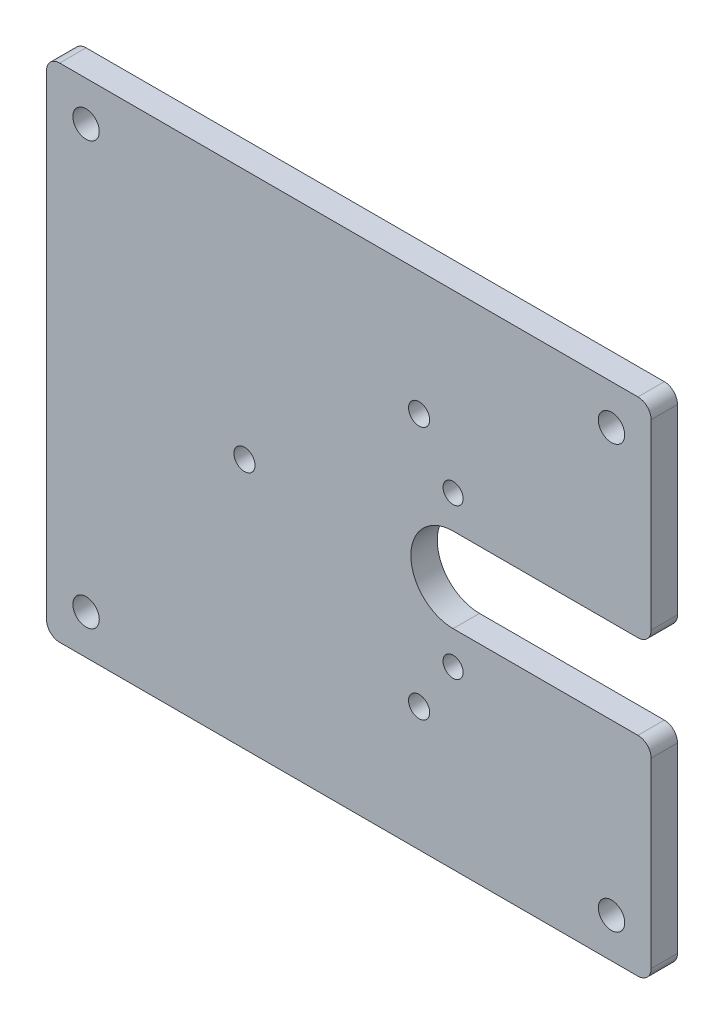
ISO-10303-21;
HEADER;
FILE_DESCRIPTION(('STEP AP214'),'2;1');
FILE_NAME('part.step','',(''),(''),'','','');
FILE_SCHEMA(('AUTOMOTIVE_DESIGN { 1 0 10303 214 1 1 1 1 }'));
ENDSEC;
DATA;
#1=APPLICATION_CONTEXT('core data for automotive mechanical design processes');
#2=APPLICATION_PROTOCOL_DEFINITION('international standard','automotive_design',2000,#1);
#3=PRODUCT_CONTEXT('',#1,'mechanical');
#4=PRODUCT('Part','Part','',(#3));
#5=PRODUCT_RELATED_PRODUCT_CATEGORY('part','',(#4));
#6=PRODUCT_DEFINITION_FORMATION('','',#4);
#7=PRODUCT_DEFINITION_CONTEXT('part definition',#1,'design');
#8=PRODUCT_DEFINITION('design','',#6,#7);
#9=PRODUCT_DEFINITION_SHAPE('','',#8);
#10=(LENGTH_UNIT() NAMED_UNIT(*) SI_UNIT(.MILLI.,.METRE.));
#11=(NAMED_UNIT(*) PLANE_ANGLE_UNIT() SI_UNIT($,.RADIAN.));
#12=(NAMED_UNIT(*) SI_UNIT($,.STERADIAN.) SOLID_ANGLE_UNIT());
#13=UNCERTAINTY_MEASURE_WITH_UNIT(LENGTH_MEASURE(1.E-05),#10,'distance_accuracy_value','');
#14=(GEOMETRIC_REPRESENTATION_CONTEXT(3) GLOBAL_UNCERTAINTY_ASSIGNED_CONTEXT((#13)) GLOBAL_UNIT_ASSIGNED_CONTEXT((#10,
#11,#12)) REPRESENTATION_CONTEXT('',''));
#15=CARTESIAN_POINT('',(0.,0.,0.));
#16=DIRECTION('',(0.,0.,1.));
#17=DIRECTION('',(1.,0.,0.));
#18=AXIS2_PLACEMENT_3D('',#15,#16,#17);
#19=CARTESIAN_POINT('',(57.,45.,5.));
#20=DIRECTION('',(0.,0.,-1.));
#21=DIRECTION('',(-1.,0.,0.));
#22=AXIS2_PLACEMENT_3D('',#19,#20,#21);
#23=PLANE('',#22);
#24=CARTESIAN_POINT('',(57.,45.,5.));
#25=DIRECTION('',(0.,0.,1.));
#26=DIRECTION('',(-1.,0.,0.));
#27=AXIS2_PLACEMENT_3D('',#24,#25,#26);
#28=CIRCLE('',#27,2.50000000000001);
#29=CARTESIAN_POINT('',(59.5,45.,5.));
#30=VERTEX_POINT('',#29);
#31=CARTESIAN_POINT('',(57.,47.5,5.));
#32=VERTEX_POINT('',#31);
#33=EDGE_CURVE('E196',#30,#32,#28,.T.);
#34=ORIENTED_EDGE('',*,*,#33,.T.);
#35=DIRECTION('',(-1.,0.,0.));
#36=VECTOR('',#35,1.);
#37=CARTESIAN_POINT('',(-52.5,47.5,5.));
#38=LINE('',#37,#36);
#39=CARTESIAN_POINT('',(-52.5,47.5,5.));
#40=VERTEX_POINT('',#39);
#41=EDGE_CURVE('E114',#32,#40,#38,.T.);
#42=ORIENTED_EDGE('',*,*,#41,.T.);
#43=CARTESIAN_POINT('',(-52.5,45.,5.));
#44=DIRECTION('',(0.,0.,1.));
#45=DIRECTION('',(1.,0.,0.));
#46=AXIS2_PLACEMENT_3D('',#43,#44,#45);
#47=CIRCLE('',#46,2.5);
#48=CARTESIAN_POINT('',(-55.,45.,5.));
#49=VERTEX_POINT('',#48);
#50=EDGE_CURVE('E229',#40,#49,#47,.T.);
#51=ORIENTED_EDGE('',*,*,#50,.T.);
#52=DIRECTION('',(0.,-1.,0.));
#53=VECTOR('',#52,1.);
#54=CARTESIAN_POINT('',(-55.,45.,5.));
#55=LINE('',#54,#53);
#56=CARTESIAN_POINT('',(-55.,-45.,5.));
#57=VERTEX_POINT('',#56);
#58=EDGE_CURVE('E248',#49,#57,#55,.T.);
#59=ORIENTED_EDGE('',*,*,#58,.T.);
#60=CARTESIAN_POINT('',(-52.5,-45.,5.));
#61=DIRECTION('',(0.,0.,1.));
#62=DIRECTION('',(-1.,0.,0.));
#63=AXIS2_PLACEMENT_3D('',#60,#61,#62);
#64=CIRCLE('',#63,2.5);
#65=CARTESIAN_POINT('',(-52.5,-47.5,5.));
#66=VERTEX_POINT('',#65);
#67=EDGE_CURVE('E245',#57,#66,#64,.T.);
#68=ORIENTED_EDGE('',*,*,#67,.T.);
#69=DIRECTION('',(1.,0.,0.));
#70=VECTOR('',#69,1.);
#71=CARTESIAN_POINT('',(-52.5,-47.5,5.));
#72=LINE('',#71,#70);
#73=CARTESIAN_POINT('',(57.,-47.5,5.));
#74=VERTEX_POINT('',#73);
#75=EDGE_CURVE('E247',#66,#74,#72,.T.);
#76=ORIENTED_EDGE('',*,*,#75,.T.);
#77=CARTESIAN_POINT('',(57.,-45.,5.));
#78=DIRECTION('',(0.,0.,1.));
#79=DIRECTION('',(1.,0.,0.));
#80=AXIS2_PLACEMENT_3D('',#77,#78,#79);
#81=CIRCLE('',#80,2.50000000000001);
#82=CARTESIAN_POINT('',(59.5,-45.,5.));
#83=VERTEX_POINT('',#82);
#84=EDGE_CURVE('E250',#74,#83,#81,.T.);
#85=ORIENTED_EDGE('',*,*,#84,.T.);
#86=DIRECTION('',(0.,1.,0.));
#87=VECTOR('',#86,1.);
#88=CARTESIAN_POINT('',(59.5,-45.,5.));
#89=LINE('',#88,#87);
#90=CARTESIAN_POINT('',(59.5,-10.5,5.));
#91=VERTEX_POINT('',#90);
#92=EDGE_CURVE('E256',#83,#91,#89,.T.);
#93=ORIENTED_EDGE('',*,*,#92,.T.);
#94=CARTESIAN_POINT('',(57.,-10.5,5.));
#95=DIRECTION('',(0.,0.,1.));
#96=DIRECTION('',(-1.,0.,0.));
#97=AXIS2_PLACEMENT_3D('',#94,#95,#96);
#98=CIRCLE('',#97,2.5);
#99=CARTESIAN_POINT('',(57.,-8.,5.));
#100=VERTEX_POINT('',#99);
#101=EDGE_CURVE('E258',#91,#100,#98,.T.);
#102=ORIENTED_EDGE('',*,*,#101,.T.);
#103=DIRECTION('',(-1.,0.,0.));
#104=VECTOR('',#103,1.);
#105=CARTESIAN_POINT('',(22.,-8.,5.));
#106=LINE('',#105,#104);
#107=CARTESIAN_POINT('',(22.,-8.,5.));
#108=VERTEX_POINT('',#107);
#109=EDGE_CURVE('E260',#100,#108,#106,.T.);
#110=ORIENTED_EDGE('',*,*,#109,.T.);
#111=CARTESIAN_POINT('',(22.,0.,5.));
#112=DIRECTION('',(0.,0.,-1.));
#113=DIRECTION('',(1.,0.,0.));
#114=AXIS2_PLACEMENT_3D('',#111,#112,#113);
#115=CIRCLE('',#114,8.);
#116=CARTESIAN_POINT('',(22.,8.,5.));
#117=VERTEX_POINT('',#116);
#118=EDGE_CURVE('E151',#108,#117,#115,.T.);
#119=ORIENTED_EDGE('',*,*,#118,.T.);
#120=DIRECTION('',(1.,0.,0.));
#121=VECTOR('',#120,1.);
#122=CARTESIAN_POINT('',(22.,8.,5.));
#123=LINE('',#122,#121);
#124=CARTESIAN_POINT('',(57.,8.,5.));
#125=VERTEX_POINT('',#124);
#126=EDGE_CURVE('E145',#117,#125,#123,.T.);
#127=ORIENTED_EDGE('',*,*,#126,.T.);
#128=CARTESIAN_POINT('',(57.,10.5,5.));
#129=DIRECTION('',(0.,0.,1.));
#130=DIRECTION('',(1.,0.,0.));
#131=AXIS2_PLACEMENT_3D('',#128,#129,#130);
#132=CIRCLE('',#131,2.5);
#133=CARTESIAN_POINT('',(59.5,10.5,5.));
#134=VERTEX_POINT('',#133);
#135=EDGE_CURVE('E149',#125,#134,#132,.T.);
#136=ORIENTED_EDGE('',*,*,#135,.T.);
#137=DIRECTION('',(0.,1.,0.));
#138=VECTOR('',#137,1.);
#139=CARTESIAN_POINT('',(59.5,45.,5.));
#140=LINE('',#139,#138);
#141=EDGE_CURVE('E53',#134,#30,#140,.T.);
#142=ORIENTED_EDGE('',*,*,#141,.T.);
#143=EDGE_LOOP('',(#34,#42,#51,#59,#68,#76,#85,#93,#102,#110,#119,#127,#136,#142));
#144=FACE_BOUND('',#143,.T.);
#145=CARTESIAN_POINT('',(22.,-14.25,5.));
#146=DIRECTION('',(0.,0.,1.));
#147=DIRECTION('',(1.,0.,0.));
#148=AXIS2_PLACEMENT_3D('',#145,#146,#147);
#149=CIRCLE('',#148,1.9);
#150=CARTESIAN_POINT('',(23.9,-14.25,5.));
#151=VERTEX_POINT('',#150);
#152=EDGE_CURVE('E173',#151,#151,#149,.T.);
#153=ORIENTED_EDGE('',*,*,#152,.F.);
#154=EDGE_LOOP('',(#153));
#155=FACE_BOUND('',#154,.T.);
#156=CARTESIAN_POINT('',(15.5628034052081,-24.,5.));
#157=DIRECTION('',(0.,0.,1.));
#158=DIRECTION('',(1.,0.,0.));
#159=AXIS2_PLACEMENT_3D('',#156,#157,#158);
#160=CIRCLE('',#159,2.);
#161=CARTESIAN_POINT('',(17.5628034052081,-24.,5.));
#162=VERTEX_POINT('',#161);
#163=EDGE_CURVE('E374',#162,#162,#160,.T.);
#164=ORIENTED_EDGE('',*,*,#163,.F.);
#165=EDGE_LOOP('',(#164));
#166=FACE_BOUND('',#165,.T.);
#167=CARTESIAN_POINT('',(15.5628034052081,24.,5.));
#168=DIRECTION('',(0.,0.,1.));
#169=DIRECTION('',(-1.,0.,0.));
#170=AXIS2_PLACEMENT_3D('',#167,#168,#169);
#171=CIRCLE('',#170,2.);
#172=CARTESIAN_POINT('',(13.5628034052081,24.,5.));
#173=VERTEX_POINT('',#172);
#174=EDGE_CURVE('E368',#173,#173,#171,.T.);
#175=ORIENTED_EDGE('',*,*,#174,.F.);
#176=EDGE_LOOP('',(#175));
#177=FACE_BOUND('',#176,.T.);
#178=CARTESIAN_POINT('',(22.,14.25,5.));
#179=DIRECTION('',(0.,0.,1.));
#180=DIRECTION('',(-1.,0.,0.));
#181=AXIS2_PLACEMENT_3D('',#178,#179,#180);
#182=CIRCLE('',#181,1.9);
#183=CARTESIAN_POINT('',(20.1,14.25,5.));
#184=VERTEX_POINT('',#183);
#185=EDGE_CURVE('E362',#184,#184,#182,.T.);
#186=ORIENTED_EDGE('',*,*,#185,.F.);
#187=EDGE_LOOP('',(#186));
#188=FACE_BOUND('',#187,.T.);
#189=CARTESIAN_POINT('',(-17.5,0.,5.));
#190=DIRECTION('',(0.,0.,1.));
#191=DIRECTION('',(1.,0.,0.));
#192=AXIS2_PLACEMENT_3D('',#189,#190,#191);
#193=CIRCLE('',#192,2.);
#194=CARTESIAN_POINT('',(-15.5,0.,5.));
#195=VERTEX_POINT('',#194);
#196=EDGE_CURVE('E356',#195,#195,#193,.T.);
#197=ORIENTED_EDGE('',*,*,#196,.F.);
#198=EDGE_LOOP('',(#197));
#199=FACE_BOUND('',#198,.T.);
#200=CARTESIAN_POINT('',(52.,-40.,5.));
#201=DIRECTION('',(0.,0.,1.));
#202=DIRECTION('',(1.,0.,0.));
#203=AXIS2_PLACEMENT_3D('',#200,#201,#202);
#204=CIRCLE('',#203,2.5);
#205=CARTESIAN_POINT('',(54.5,-40.,5.));
#206=VERTEX_POINT('',#205);
#207=EDGE_CURVE('E350',#206,#206,#204,.T.);
#208=ORIENTED_EDGE('',*,*,#207,.F.);
#209=EDGE_LOOP('',(#208));
#210=FACE_BOUND('',#209,.T.);
#211=CARTESIAN_POINT('',(-47.5,-40.,5.));
#212=DIRECTION('',(0.,0.,1.));
#213=DIRECTION('',(1.,0.,0.));
#214=AXIS2_PLACEMENT_3D('',#211,#212,#213);
#215=CIRCLE('',#214,2.5);
#216=CARTESIAN_POINT('',(-45.,-40.,5.));
#217=VERTEX_POINT('',#216);
#218=EDGE_CURVE('E344',#217,#217,#215,.T.);
#219=ORIENTED_EDGE('',*,*,#218,.F.);
#220=EDGE_LOOP('',(#219));
#221=FACE_BOUND('',#220,.T.);
#222=CARTESIAN_POINT('',(-47.5,40.,5.));
#223=DIRECTION('',(0.,0.,1.));
#224=DIRECTION('',(-1.,0.,0.));
#225=AXIS2_PLACEMENT_3D('',#222,#223,#224);
#226=CIRCLE('',#225,2.5);
#227=CARTESIAN_POINT('',(-50.,40.,5.));
#228=VERTEX_POINT('',#227);
#229=EDGE_CURVE('E338',#228,#228,#226,.T.);
#230=ORIENTED_EDGE('',*,*,#229,.F.);
#231=EDGE_LOOP('',(#230));
#232=FACE_BOUND('',#231,.T.);
#233=CARTESIAN_POINT('',(52.,40.,5.));
#234=DIRECTION('',(0.,0.,1.));
#235=DIRECTION('',(-1.,0.,0.));
#236=AXIS2_PLACEMENT_3D('',#233,#234,#235);
#237=CIRCLE('',#236,2.5);
#238=CARTESIAN_POINT('',(49.5,40.,5.));
#239=VERTEX_POINT('',#238);
#240=EDGE_CURVE('E329',#239,#239,#237,.T.);
#241=ORIENTED_EDGE('',*,*,#240,.F.);
#242=EDGE_LOOP('',(#241));
#243=FACE_BOUND('',#242,.T.);
#244=ADVANCED_FACE('F36',(#144,#155,#166,#177,#188,#199,#210,#221,#232,#243),#23,.F.);
#245=CARTESIAN_POINT('',(57.,45.,0.));
#246=DIRECTION('',(0.,0.,-1.));
#247=DIRECTION('',(-1.,0.,0.));
#248=AXIS2_PLACEMENT_3D('',#245,#246,#247);
#249=PLANE('',#248);
#250=CARTESIAN_POINT('',(-47.5,40.,0.));
#251=DIRECTION('',(0.,0.,1.));
#252=DIRECTION('',(-1.,0.,0.));
#253=AXIS2_PLACEMENT_3D('',#250,#251,#252);
#254=CIRCLE('',#253,2.5);
#255=CARTESIAN_POINT('',(-50.,40.,0.));
#256=VERTEX_POINT('',#255);
#257=EDGE_CURVE('E335',#256,#256,#254,.T.);
#258=ORIENTED_EDGE('',*,*,#257,.T.);
#259=EDGE_LOOP('',(#258));
#260=FACE_BOUND('',#259,.T.);
#261=CARTESIAN_POINT('',(52.,-40.,0.));
#262=DIRECTION('',(0.,0.,1.));
#263=DIRECTION('',(1.,0.,0.));
#264=AXIS2_PLACEMENT_3D('',#261,#262,#263);
#265=CIRCLE('',#264,2.5);
#266=CARTESIAN_POINT('',(54.5,-40.,0.));
#267=VERTEX_POINT('',#266);
#268=EDGE_CURVE('E347',#267,#267,#265,.T.);
#269=ORIENTED_EDGE('',*,*,#268,.T.);
#270=EDGE_LOOP('',(#269));
#271=FACE_BOUND('',#270,.T.);
#272=CARTESIAN_POINT('',(22.,14.25,0.));
#273=DIRECTION('',(0.,0.,1.));
#274=DIRECTION('',(-1.,0.,0.));
#275=AXIS2_PLACEMENT_3D('',#272,#273,#274);
#276=CIRCLE('',#275,1.9);
#277=CARTESIAN_POINT('',(20.1,14.25,0.));
#278=VERTEX_POINT('',#277);
#279=EDGE_CURVE('E359',#278,#278,#276,.T.);
#280=ORIENTED_EDGE('',*,*,#279,.T.);
#281=EDGE_LOOP('',(#280));
#282=FACE_BOUND('',#281,.T.);
#283=CARTESIAN_POINT('',(15.5628034052081,-24.,0.));
#284=DIRECTION('',(0.,0.,1.));
#285=DIRECTION('',(1.,0.,0.));
#286=AXIS2_PLACEMENT_3D('',#283,#284,#285);
#287=CIRCLE('',#286,2.);
#288=CARTESIAN_POINT('',(17.5628034052081,-24.,0.));
#289=VERTEX_POINT('',#288);
#290=EDGE_CURVE('E371',#289,#289,#287,.T.);
#291=ORIENTED_EDGE('',*,*,#290,.T.);
#292=EDGE_LOOP('',(#291));
#293=FACE_BOUND('',#292,.T.);
#294=CARTESIAN_POINT('',(57.,45.,0.));
#295=DIRECTION('',(0.,0.,1.));
#296=DIRECTION('',(-1.,0.,0.));
#297=AXIS2_PLACEMENT_3D('',#294,#295,#296);
#298=CIRCLE('',#297,2.50000000000001);
#299=CARTESIAN_POINT('',(59.5,45.,0.));
#300=VERTEX_POINT('',#299);
#301=CARTESIAN_POINT('',(57.,47.5,0.));
#302=VERTEX_POINT('',#301);
#303=EDGE_CURVE('E169',#300,#302,#298,.T.);
#304=ORIENTED_EDGE('',*,*,#303,.F.);
#305=DIRECTION('',(0.,1.,0.));
#306=VECTOR('',#305,1.);
#307=CARTESIAN_POINT('',(59.5,45.,0.));
#308=LINE('',#307,#306);
#309=CARTESIAN_POINT('',(59.5,10.5,0.));
#310=VERTEX_POINT('',#309);
#311=EDGE_CURVE('E106',#310,#300,#308,.T.);
#312=ORIENTED_EDGE('',*,*,#311,.F.);
#313=CARTESIAN_POINT('',(57.,10.5,0.));
#314=DIRECTION('',(0.,0.,1.));
#315=DIRECTION('',(1.,0.,0.));
#316=AXIS2_PLACEMENT_3D('',#313,#314,#315);
#317=CIRCLE('',#316,2.5);
#318=CARTESIAN_POINT('',(57.,8.,0.));
#319=VERTEX_POINT('',#318);
#320=EDGE_CURVE('E100',#319,#310,#317,.T.);
#321=ORIENTED_EDGE('',*,*,#320,.F.);
#322=DIRECTION('',(1.,0.,0.));
#323=VECTOR('',#322,1.);
#324=CARTESIAN_POINT('',(22.,8.,0.));
#325=LINE('',#324,#323);
#326=CARTESIAN_POINT('',(22.,8.,0.));
#327=VERTEX_POINT('',#326);
#328=EDGE_CURVE('E159',#327,#319,#325,.T.);
#329=ORIENTED_EDGE('',*,*,#328,.F.);
#330=CARTESIAN_POINT('',(22.,0.,0.));
#331=DIRECTION('',(0.,0.,-1.));
#332=DIRECTION('',(1.,0.,0.));
#333=AXIS2_PLACEMENT_3D('',#330,#331,#332);
#334=CIRCLE('',#333,8.);
#335=CARTESIAN_POINT('',(22.,-8.,0.));
#336=VERTEX_POINT('',#335);
#337=EDGE_CURVE('E191',#336,#327,#334,.T.);
#338=ORIENTED_EDGE('',*,*,#337,.F.);
#339=DIRECTION('',(-1.,0.,0.));
#340=VECTOR('',#339,1.);
#341=CARTESIAN_POINT('',(22.,-8.,0.));
#342=LINE('',#341,#340);
#343=CARTESIAN_POINT('',(57.,-8.,0.));
#344=VERTEX_POINT('',#343);
#345=EDGE_CURVE('E189',#344,#336,#342,.T.);
#346=ORIENTED_EDGE('',*,*,#345,.F.);
#347=CARTESIAN_POINT('',(57.,-10.5,0.));
#348=DIRECTION('',(0.,0.,1.));
#349=DIRECTION('',(-1.,0.,0.));
#350=AXIS2_PLACEMENT_3D('',#347,#348,#349);
#351=CIRCLE('',#350,2.5);
#352=CARTESIAN_POINT('',(59.5,-10.5,0.));
#353=VERTEX_POINT('',#352);
#354=EDGE_CURVE('E187',#353,#344,#351,.T.);
#355=ORIENTED_EDGE('',*,*,#354,.F.);
#356=DIRECTION('',(0.,1.,0.));
#357=VECTOR('',#356,1.);
#358=CARTESIAN_POINT('',(59.5,-45.,0.));
#359=LINE('',#358,#357);
#360=CARTESIAN_POINT('',(59.5,-45.,0.));
#361=VERTEX_POINT('',#360);
#362=EDGE_CURVE('E185',#361,#353,#359,.T.);
#363=ORIENTED_EDGE('',*,*,#362,.F.);
#364=CARTESIAN_POINT('',(57.,-45.,0.));
#365=DIRECTION('',(0.,0.,1.));
#366=DIRECTION('',(1.,0.,0.));
#367=AXIS2_PLACEMENT_3D('',#364,#365,#366);
#368=CIRCLE('',#367,2.50000000000001);
#369=CARTESIAN_POINT('',(57.,-47.5,0.));
#370=VERTEX_POINT('',#369);
#371=EDGE_CURVE('E183',#370,#361,#368,.T.);
#372=ORIENTED_EDGE('',*,*,#371,.F.);
#373=DIRECTION('',(1.,0.,0.));
#374=VECTOR('',#373,1.);
#375=CARTESIAN_POINT('',(-52.5,-47.5,0.));
#376=LINE('',#375,#374);
#377=CARTESIAN_POINT('',(-52.5,-47.5,0.));
#378=VERTEX_POINT('',#377);
#379=EDGE_CURVE('E181',#378,#370,#376,.T.);
#380=ORIENTED_EDGE('',*,*,#379,.F.);
#381=CARTESIAN_POINT('',(-52.5,-45.,0.));
#382=DIRECTION('',(0.,0.,1.));
#383=DIRECTION('',(-1.,0.,0.));
#384=AXIS2_PLACEMENT_3D('',#381,#382,#383);
#385=CIRCLE('',#384,2.5);
#386=CARTESIAN_POINT('',(-55.,-45.,0.));
#387=VERTEX_POINT('',#386);
#388=EDGE_CURVE('E179',#387,#378,#385,.T.);
#389=ORIENTED_EDGE('',*,*,#388,.F.);
#390=DIRECTION('',(0.,-1.,0.));
#391=VECTOR('',#390,1.);
#392=CARTESIAN_POINT('',(-55.,45.,0.));
#393=LINE('',#392,#391);
#394=CARTESIAN_POINT('',(-55.,45.,0.));
#395=VERTEX_POINT('',#394);
#396=EDGE_CURVE('E177',#395,#387,#393,.T.);
#397=ORIENTED_EDGE('',*,*,#396,.F.);
#398=CARTESIAN_POINT('',(-52.5,45.,0.));
#399=DIRECTION('',(0.,0.,1.));
#400=DIRECTION('',(1.,0.,0.));
#401=AXIS2_PLACEMENT_3D('',#398,#399,#400);
#402=CIRCLE('',#401,2.5);
#403=CARTESIAN_POINT('',(-52.5,47.5,0.));
#404=VERTEX_POINT('',#403);
#405=EDGE_CURVE('E175',#404,#395,#402,.T.);
#406=ORIENTED_EDGE('',*,*,#405,.F.);
#407=DIRECTION('',(-1.,0.,0.));
#408=VECTOR('',#407,1.);
#409=CARTESIAN_POINT('',(-52.5,47.5,0.));
#410=LINE('',#409,#408);
#411=EDGE_CURVE('E172',#302,#404,#410,.T.);
#412=ORIENTED_EDGE('',*,*,#411,.F.);
#413=EDGE_LOOP('',(#304,#312,#321,#329,#338,#346,#355,#363,#372,#380,#389,#397,#406,#412));
#414=FACE_BOUND('',#413,.T.);
#415=CARTESIAN_POINT('',(22.,-14.25,0.));
#416=DIRECTION('',(0.,0.,1.));
#417=DIRECTION('',(1.,0.,0.));
#418=AXIS2_PLACEMENT_3D('',#415,#416,#417);
#419=CIRCLE('',#418,1.9);
#420=CARTESIAN_POINT('',(23.9,-14.25,0.));
#421=VERTEX_POINT('',#420);
#422=EDGE_CURVE('E377',#421,#421,#419,.T.);
#423=ORIENTED_EDGE('',*,*,#422,.T.);
#424=EDGE_LOOP('',(#423));
#425=FACE_BOUND('',#424,.T.);
#426=CARTESIAN_POINT('',(15.5628034052081,24.,0.));
#427=DIRECTION('',(0.,0.,1.));
#428=DIRECTION('',(-1.,0.,0.));
#429=AXIS2_PLACEMENT_3D('',#426,#427,#428);
#430=CIRCLE('',#429,2.);
#431=CARTESIAN_POINT('',(13.5628034052081,24.,0.));
#432=VERTEX_POINT('',#431);
#433=EDGE_CURVE('E365',#432,#432,#430,.T.);
#434=ORIENTED_EDGE('',*,*,#433,.T.);
#435=EDGE_LOOP('',(#434));
#436=FACE_BOUND('',#435,.T.);
#437=CARTESIAN_POINT('',(-17.5,0.,0.));
#438=DIRECTION('',(0.,0.,1.));
#439=DIRECTION('',(1.,0.,0.));
#440=AXIS2_PLACEMENT_3D('',#437,#438,#439);
#441=CIRCLE('',#440,2.);
#442=CARTESIAN_POINT('',(-15.5,0.,0.));
#443=VERTEX_POINT('',#442);
#444=EDGE_CURVE('E353',#443,#443,#441,.T.);
#445=ORIENTED_EDGE('',*,*,#444,.T.);
#446=EDGE_LOOP('',(#445));
#447=FACE_BOUND('',#446,.T.);
#448=CARTESIAN_POINT('',(-47.5,-40.,0.));
#449=DIRECTION('',(0.,0.,1.));
#450=DIRECTION('',(1.,0.,0.));
#451=AXIS2_PLACEMENT_3D('',#448,#449,#450);
#452=CIRCLE('',#451,2.5);
#453=CARTESIAN_POINT('',(-45.,-40.,0.));
#454=VERTEX_POINT('',#453);
#455=EDGE_CURVE('E341',#454,#454,#452,.T.);
#456=ORIENTED_EDGE('',*,*,#455,.T.);
#457=EDGE_LOOP('',(#456));
#458=FACE_BOUND('',#457,.T.);
#459=CARTESIAN_POINT('',(52.,40.,0.));
#460=DIRECTION('',(0.,0.,1.));
#461=DIRECTION('',(-1.,0.,0.));
#462=AXIS2_PLACEMENT_3D('',#459,#460,#461);
#463=CIRCLE('',#462,2.5);
#464=CARTESIAN_POINT('',(49.5,40.,0.));
#465=VERTEX_POINT('',#464);
#466=EDGE_CURVE('E332',#465,#465,#463,.T.);
#467=ORIENTED_EDGE('',*,*,#466,.T.);
#468=EDGE_LOOP('',(#467));
#469=FACE_BOUND('',#468,.T.);
#470=ADVANCED_FACE('F233',(#260,#271,#282,#293,#414,#425,#436,#447,#458,#469),#249,.T.);
#471=CARTESIAN_POINT('',(57.,45.,5.));
#472=DIRECTION('',(0.,0.,-1.));
#473=DIRECTION('',(-1.,0.,0.));
#474=AXIS2_PLACEMENT_3D('',#471,#472,#473);
#475=CYLINDRICAL_SURFACE('',#474,2.50000000000001);
#476=ORIENTED_EDGE('',*,*,#303,.T.);
#477=DIRECTION('',(0.,0.,-1.));
#478=VECTOR('',#477,1.);
#479=CARTESIAN_POINT('',(57.,47.5,5.));
#480=LINE('',#479,#478);
#481=EDGE_CURVE('E11',#32,#302,#480,.T.);
#482=ORIENTED_EDGE('',*,*,#481,.F.);
#483=ORIENTED_EDGE('',*,*,#33,.F.);
#484=DIRECTION('',(0.,0.,-1.));
#485=VECTOR('',#484,1.);
#486=CARTESIAN_POINT('',(59.5,45.,5.));
#487=LINE('',#486,#485);
#488=EDGE_CURVE('E165',#30,#300,#487,.T.);
#489=ORIENTED_EDGE('',*,*,#488,.T.);
#490=EDGE_LOOP('',(#476,#482,#483,#489));
#491=FACE_BOUND('',#490,.T.);
#492=ADVANCED_FACE('F38',(#491),#475,.T.);
#493=CARTESIAN_POINT('',(-52.5,47.5,5.));
#494=DIRECTION('',(0.,-1.,0.));
#495=DIRECTION('',(0.,0.,-1.));
#496=AXIS2_PLACEMENT_3D('',#493,#494,#495);
#497=PLANE('',#496);
#498=ORIENTED_EDGE('',*,*,#411,.T.);
#499=DIRECTION('',(0.,0.,-1.));
#500=VECTOR('',#499,1.);
#501=CARTESIAN_POINT('',(-52.5,47.5,5.));
#502=LINE('',#501,#500);
#503=EDGE_CURVE('E45',#40,#404,#502,.T.);
#504=ORIENTED_EDGE('',*,*,#503,.F.);
#505=ORIENTED_EDGE('',*,*,#41,.F.);
#506=ORIENTED_EDGE('',*,*,#481,.T.);
#507=EDGE_LOOP('',(#498,#504,#505,#506));
#508=FACE_BOUND('',#507,.T.);
#509=ADVANCED_FACE('F554',(#508),#497,.F.);
#510=CARTESIAN_POINT('',(-52.5,45.,5.));
#511=DIRECTION('',(0.,0.,-1.));
#512=DIRECTION('',(-1.,0.,0.));
#513=AXIS2_PLACEMENT_3D('',#510,#511,#512);
#514=CYLINDRICAL_SURFACE('',#513,2.5);
#515=ORIENTED_EDGE('',*,*,#405,.T.);
#516=DIRECTION('',(0.,0.,-1.));
#517=VECTOR('',#516,1.);
#518=CARTESIAN_POINT('',(-55.,45.,5.));
#519=LINE('',#518,#517);
#520=EDGE_CURVE('E221',#49,#395,#519,.T.);
#521=ORIENTED_EDGE('',*,*,#520,.F.);
#522=ORIENTED_EDGE('',*,*,#50,.F.);
#523=ORIENTED_EDGE('',*,*,#503,.T.);
#524=EDGE_LOOP('',(#515,#521,#522,#523));
#525=FACE_BOUND('',#524,.T.);
#526=ADVANCED_FACE('F227',(#525),#514,.T.);
#527=CARTESIAN_POINT('',(-55.,45.,5.));
#528=DIRECTION('',(1.,0.,0.));
#529=DIRECTION('',(0.,0.,-1.));
#530=AXIS2_PLACEMENT_3D('',#527,#528,#529);
#531=PLANE('',#530);
#532=ORIENTED_EDGE('',*,*,#396,.T.);
#533=DIRECTION('',(0.,0.,-1.));
#534=VECTOR('',#533,1.);
#535=CARTESIAN_POINT('',(-55.,-45.,5.));
#536=LINE('',#535,#534);
#537=EDGE_CURVE('E218',#57,#387,#536,.T.);
#538=ORIENTED_EDGE('',*,*,#537,.F.);
#539=ORIENTED_EDGE('',*,*,#58,.F.);
#540=ORIENTED_EDGE('',*,*,#520,.T.);
#541=EDGE_LOOP('',(#532,#538,#539,#540));
#542=FACE_BOUND('',#541,.T.);
#543=ADVANCED_FACE('F239',(#542),#531,.F.);
#544=CARTESIAN_POINT('',(-52.5,-45.,5.));
#545=DIRECTION('',(0.,0.,-1.));
#546=DIRECTION('',(-1.,0.,0.));
#547=AXIS2_PLACEMENT_3D('',#544,#545,#546);
#548=CYLINDRICAL_SURFACE('',#547,2.5);
#549=ORIENTED_EDGE('',*,*,#388,.T.);
#550=DIRECTION('',(0.,0.,-1.));
#551=VECTOR('',#550,1.);
#552=CARTESIAN_POINT('',(-52.5,-47.5,5.));
#553=LINE('',#552,#551);
#554=EDGE_CURVE('E215',#66,#378,#553,.T.);
#555=ORIENTED_EDGE('',*,*,#554,.F.);
#556=ORIENTED_EDGE('',*,*,#67,.F.);
#557=ORIENTED_EDGE('',*,*,#537,.T.);
#558=EDGE_LOOP('',(#549,#555,#556,#557));
#559=FACE_BOUND('',#558,.T.);
#560=ADVANCED_FACE('F243',(#559),#548,.T.);
#561=CARTESIAN_POINT('',(-52.5,-47.5,5.));
#562=DIRECTION('',(0.,1.,0.));
#563=DIRECTION('',(0.,0.,1.));
#564=AXIS2_PLACEMENT_3D('',#561,#562,#563);
#565=PLANE('',#564);
#566=ORIENTED_EDGE('',*,*,#379,.T.);
#567=DIRECTION('',(0.,0.,-1.));
#568=VECTOR('',#567,1.);
#569=CARTESIAN_POINT('',(57.,-47.5,5.));
#570=LINE('',#569,#568);
#571=EDGE_CURVE('E212',#74,#370,#570,.T.);
#572=ORIENTED_EDGE('',*,*,#571,.F.);
#573=ORIENTED_EDGE('',*,*,#75,.F.);
#574=ORIENTED_EDGE('',*,*,#554,.T.);
#575=EDGE_LOOP('',(#566,#572,#573,#574));
#576=FACE_BOUND('',#575,.T.);
#577=ADVANCED_FACE('F519',(#576),#565,.F.);
#578=CARTESIAN_POINT('',(57.,-45.,5.));
#579=DIRECTION('',(0.,0.,-1.));
#580=DIRECTION('',(-1.,0.,0.));
#581=AXIS2_PLACEMENT_3D('',#578,#579,#580);
#582=CYLINDRICAL_SURFACE('',#581,2.50000000000001);
#583=ORIENTED_EDGE('',*,*,#371,.T.);
#584=DIRECTION('',(0.,0.,-1.));
#585=VECTOR('',#584,1.);
#586=CARTESIAN_POINT('',(59.5,-45.,5.));
#587=LINE('',#586,#585);
#588=EDGE_CURVE('E209',#83,#361,#587,.T.);
#589=ORIENTED_EDGE('',*,*,#588,.F.);
#590=ORIENTED_EDGE('',*,*,#84,.F.);
#591=ORIENTED_EDGE('',*,*,#571,.T.);
#592=EDGE_LOOP('',(#583,#589,#590,#591));
#593=FACE_BOUND('',#592,.T.);
#594=ADVANCED_FACE('F509',(#593),#582,.T.);
#595=CARTESIAN_POINT('',(59.5,-45.,5.));
#596=DIRECTION('',(-1.,0.,0.));
#597=DIRECTION('',(0.,0.,1.));
#598=AXIS2_PLACEMENT_3D('',#595,#596,#597);
#599=PLANE('',#598);
#600=ORIENTED_EDGE('',*,*,#362,.T.);
#601=DIRECTION('',(0.,0.,-1.));
#602=VECTOR('',#601,1.);
#603=CARTESIAN_POINT('',(59.5,-10.5,5.));
#604=LINE('',#603,#602);
#605=EDGE_CURVE('E206',#91,#353,#604,.T.);
#606=ORIENTED_EDGE('',*,*,#605,.F.);
#607=ORIENTED_EDGE('',*,*,#92,.F.);
#608=ORIENTED_EDGE('',*,*,#588,.T.);
#609=EDGE_LOOP('',(#600,#606,#607,#608));
#610=FACE_BOUND('',#609,.T.);
#611=ADVANCED_FACE('F499',(#610),#599,.F.);
#612=CARTESIAN_POINT('',(57.,-10.5,5.));
#613=DIRECTION('',(0.,0.,-1.));
#614=DIRECTION('',(-1.,0.,0.));
#615=AXIS2_PLACEMENT_3D('',#612,#613,#614);
#616=CYLINDRICAL_SURFACE('',#615,2.5);
#617=ORIENTED_EDGE('',*,*,#354,.T.);
#618=DIRECTION('',(0.,0.,-1.));
#619=VECTOR('',#618,1.);
#620=CARTESIAN_POINT('',(57.,-8.,5.));
#621=LINE('',#620,#619);
#622=EDGE_CURVE('E203',#100,#344,#621,.T.);
#623=ORIENTED_EDGE('',*,*,#622,.F.);
#624=ORIENTED_EDGE('',*,*,#101,.F.);
#625=ORIENTED_EDGE('',*,*,#605,.T.);
#626=EDGE_LOOP('',(#617,#623,#624,#625));
#627=FACE_BOUND('',#626,.T.);
#628=ADVANCED_FACE('F490',(#627),#616,.T.);
#629=CARTESIAN_POINT('',(22.,-8.,5.));
#630=DIRECTION('',(0.,-1.,0.));
#631=DIRECTION('',(0.,0.,-1.));
#632=AXIS2_PLACEMENT_3D('',#629,#630,#631);
#633=PLANE('',#632);
#634=ORIENTED_EDGE('',*,*,#345,.T.);
#635=DIRECTION('',(0.,0.,-1.));
#636=VECTOR('',#635,1.);
#637=CARTESIAN_POINT('',(22.,-8.,5.));
#638=LINE('',#637,#636);
#639=EDGE_CURVE('E200',#108,#336,#638,.T.);
#640=ORIENTED_EDGE('',*,*,#639,.F.);
#641=ORIENTED_EDGE('',*,*,#109,.F.);
#642=ORIENTED_EDGE('',*,*,#622,.T.);
#643=EDGE_LOOP('',(#634,#640,#641,#642));
#644=FACE_BOUND('',#643,.T.);
#645=ADVANCED_FACE('F266',(#644),#633,.F.);
#646=CARTESIAN_POINT('',(22.,0.,5.));
#647=DIRECTION('',(0.,0.,-1.));
#648=DIRECTION('',(-1.,0.,0.));
#649=AXIS2_PLACEMENT_3D('',#646,#647,#648);
#650=CYLINDRICAL_SURFACE('',#649,8.);
#651=ORIENTED_EDGE('',*,*,#337,.T.);
#652=DIRECTION('',(0.,0.,-1.));
#653=VECTOR('',#652,1.);
#654=CARTESIAN_POINT('',(22.,8.,5.));
#655=LINE('',#654,#653);
#656=EDGE_CURVE('E160',#117,#327,#655,.T.);
#657=ORIENTED_EDGE('',*,*,#656,.F.);
#658=ORIENTED_EDGE('',*,*,#118,.F.);
#659=ORIENTED_EDGE('',*,*,#639,.T.);
#660=EDGE_LOOP('',(#651,#657,#658,#659));
#661=FACE_BOUND('',#660,.T.);
#662=ADVANCED_FACE('F270',(#661),#650,.F.);
#663=CARTESIAN_POINT('',(22.,8.,5.));
#664=DIRECTION('',(0.,1.,0.));
#665=DIRECTION('',(0.,0.,1.));
#666=AXIS2_PLACEMENT_3D('',#663,#664,#665);
#667=PLANE('',#666);
#668=ORIENTED_EDGE('',*,*,#328,.T.);
#669=DIRECTION('',(0.,0.,-1.));
#670=VECTOR('',#669,1.);
#671=CARTESIAN_POINT('',(57.,8.,5.));
#672=LINE('',#671,#670);
#673=EDGE_CURVE('E156',#125,#319,#672,.T.);
#674=ORIENTED_EDGE('',*,*,#673,.F.);
#675=ORIENTED_EDGE('',*,*,#126,.F.);
#676=ORIENTED_EDGE('',*,*,#656,.T.);
#677=EDGE_LOOP('',(#668,#674,#675,#676));
#678=FACE_BOUND('',#677,.T.);
#679=ADVANCED_FACE('F157',(#678),#667,.F.);
#680=CARTESIAN_POINT('',(57.,10.5,5.));
#681=DIRECTION('',(0.,0.,-1.));
#682=DIRECTION('',(-1.,0.,0.));
#683=AXIS2_PLACEMENT_3D('',#680,#681,#682);
#684=CYLINDRICAL_SURFACE('',#683,2.5);
#685=ORIENTED_EDGE('',*,*,#320,.T.);
#686=DIRECTION('',(0.,0.,-1.));
#687=VECTOR('',#686,1.);
#688=CARTESIAN_POINT('',(59.5,10.5,5.));
#689=LINE('',#688,#687);
#690=EDGE_CURVE('E161',#134,#310,#689,.T.);
#691=ORIENTED_EDGE('',*,*,#690,.F.);
#692=ORIENTED_EDGE('',*,*,#135,.F.);
#693=ORIENTED_EDGE('',*,*,#673,.T.);
#694=EDGE_LOOP('',(#685,#691,#692,#693));
#695=FACE_BOUND('',#694,.T.);
#696=ADVANCED_FACE('F163',(#695),#684,.T.);
#697=CARTESIAN_POINT('',(59.5,45.,5.));
#698=DIRECTION('',(-1.,0.,0.));
#699=DIRECTION('',(0.,0.,1.));
#700=AXIS2_PLACEMENT_3D('',#697,#698,#699);
#701=PLANE('',#700);
#702=ORIENTED_EDGE('',*,*,#311,.T.);
#703=ORIENTED_EDGE('',*,*,#488,.F.);
#704=ORIENTED_EDGE('',*,*,#141,.F.);
#705=ORIENTED_EDGE('',*,*,#690,.T.);
#706=EDGE_LOOP('',(#702,#703,#704,#705));
#707=FACE_BOUND('',#706,.T.);
#708=ADVANCED_FACE('F274',(#707),#701,.F.);
#709=CARTESIAN_POINT('',(22.,-14.25,5.));
#710=DIRECTION('',(0.,0.,-1.));
#711=DIRECTION('',(-1.,0.,0.));
#712=AXIS2_PLACEMENT_3D('',#709,#710,#711);
#713=CYLINDRICAL_SURFACE('',#712,1.9);
#714=ORIENTED_EDGE('',*,*,#152,.T.);
#715=EDGE_LOOP('',(#714));
#716=FACE_BOUND('',#715,.T.);
#717=ORIENTED_EDGE('',*,*,#422,.F.);
#718=EDGE_LOOP('',(#717));
#719=FACE_BOUND('',#718,.T.);
#720=ADVANCED_FACE('F276',(#716,#719),#713,.F.);
#721=CARTESIAN_POINT('',(15.5628034052081,-24.,5.));
#722=DIRECTION('',(0.,0.,-1.));
#723=DIRECTION('',(-1.,0.,0.));
#724=AXIS2_PLACEMENT_3D('',#721,#722,#723);
#725=CYLINDRICAL_SURFACE('',#724,2.);
#726=ORIENTED_EDGE('',*,*,#163,.T.);
#727=EDGE_LOOP('',(#726));
#728=FACE_BOUND('',#727,.T.);
#729=ORIENTED_EDGE('',*,*,#290,.F.);
#730=EDGE_LOOP('',(#729));
#731=FACE_BOUND('',#730,.T.);
#732=ADVANCED_FACE('F282',(#728,#731),#725,.F.);
#733=CARTESIAN_POINT('',(15.5628034052081,24.,5.));
#734=DIRECTION('',(0.,0.,-1.));
#735=DIRECTION('',(-1.,0.,0.));
#736=AXIS2_PLACEMENT_3D('',#733,#734,#735);
#737=CYLINDRICAL_SURFACE('',#736,2.);
#738=ORIENTED_EDGE('',*,*,#174,.T.);
#739=EDGE_LOOP('',(#738));
#740=FACE_BOUND('',#739,.T.);
#741=ORIENTED_EDGE('',*,*,#433,.F.);
#742=EDGE_LOOP('',(#741));
#743=FACE_BOUND('',#742,.T.);
#744=ADVANCED_FACE('F296',(#740,#743),#737,.F.);
#745=CARTESIAN_POINT('',(22.,14.25,5.));
#746=DIRECTION('',(0.,0.,-1.));
#747=DIRECTION('',(-1.,0.,0.));
#748=AXIS2_PLACEMENT_3D('',#745,#746,#747);
#749=CYLINDRICAL_SURFACE('',#748,1.9);
#750=ORIENTED_EDGE('',*,*,#185,.T.);
#751=EDGE_LOOP('',(#750));
#752=FACE_BOUND('',#751,.T.);
#753=ORIENTED_EDGE('',*,*,#279,.F.);
#754=EDGE_LOOP('',(#753));
#755=FACE_BOUND('',#754,.T.);
#756=ADVANCED_FACE('F300',(#752,#755),#749,.F.);
#757=CARTESIAN_POINT('',(-17.5,0.,5.));
#758=DIRECTION('',(0.,0.,-1.));
#759=DIRECTION('',(-1.,0.,0.));
#760=AXIS2_PLACEMENT_3D('',#757,#758,#759);
#761=CYLINDRICAL_SURFACE('',#760,2.);
#762=ORIENTED_EDGE('',*,*,#196,.T.);
#763=EDGE_LOOP('',(#762));
#764=FACE_BOUND('',#763,.T.);
#765=ORIENTED_EDGE('',*,*,#444,.F.);
#766=EDGE_LOOP('',(#765));
#767=FACE_BOUND('',#766,.T.);
#768=ADVANCED_FACE('F304',(#764,#767),#761,.F.);
#769=CARTESIAN_POINT('',(52.,-40.,5.));
#770=DIRECTION('',(0.,0.,-1.));
#771=DIRECTION('',(-1.,0.,0.));
#772=AXIS2_PLACEMENT_3D('',#769,#770,#771);
#773=CYLINDRICAL_SURFACE('',#772,2.5);
#774=ORIENTED_EDGE('',*,*,#207,.T.);
#775=EDGE_LOOP('',(#774));
#776=FACE_BOUND('',#775,.T.);
#777=ORIENTED_EDGE('',*,*,#268,.F.);
#778=EDGE_LOOP('',(#777));
#779=FACE_BOUND('',#778,.T.);
#780=ADVANCED_FACE('F308',(#776,#779),#773,.F.);
#781=CARTESIAN_POINT('',(-47.5,-40.,5.));
#782=DIRECTION('',(0.,0.,-1.));
#783=DIRECTION('',(-1.,0.,0.));
#784=AXIS2_PLACEMENT_3D('',#781,#782,#783);
#785=CYLINDRICAL_SURFACE('',#784,2.5);
#786=ORIENTED_EDGE('',*,*,#218,.T.);
#787=EDGE_LOOP('',(#786));
#788=FACE_BOUND('',#787,.T.);
#789=ORIENTED_EDGE('',*,*,#455,.F.);
#790=EDGE_LOOP('',(#789));
#791=FACE_BOUND('',#790,.T.);
#792=ADVANCED_FACE('F312',(#788,#791),#785,.F.);
#793=CARTESIAN_POINT('',(-47.5,40.,5.));
#794=DIRECTION('',(0.,0.,-1.));
#795=DIRECTION('',(-1.,0.,0.));
#796=AXIS2_PLACEMENT_3D('',#793,#794,#795);
#797=CYLINDRICAL_SURFACE('',#796,2.5);
#798=ORIENTED_EDGE('',*,*,#229,.T.);
#799=EDGE_LOOP('',(#798));
#800=FACE_BOUND('',#799,.T.);
#801=ORIENTED_EDGE('',*,*,#257,.F.);
#802=EDGE_LOOP('',(#801));
#803=FACE_BOUND('',#802,.T.);
#804=ADVANCED_FACE('F316',(#800,#803),#797,.F.);
#805=CARTESIAN_POINT('',(52.,40.,5.));
#806=DIRECTION('',(0.,0.,-1.));
#807=DIRECTION('',(-1.,0.,0.));
#808=AXIS2_PLACEMENT_3D('',#805,#806,#807);
#809=CYLINDRICAL_SURFACE('',#808,2.5);
#810=ORIENTED_EDGE('',*,*,#240,.T.);
#811=EDGE_LOOP('',(#810));
#812=FACE_BOUND('',#811,.T.);
#813=ORIENTED_EDGE('',*,*,#466,.F.);
#814=EDGE_LOOP('',(#813));
#815=FACE_BOUND('',#814,.T.);
#816=ADVANCED_FACE('F320',(#812,#815),#809,.F.);
#817=CLOSED_SHELL('',(#244,#470,#492,#509,#526,#543,#560,#577,#594,#611,#628,#645,#662,#679,
#696,#708,#720,#732,#744,#756,#768,#780,#792,#804,#816));
#818=MANIFOLD_SOLID_BREP('B2',#817);
#819=ADVANCED_BREP_SHAPE_REPRESENTATION('',(#18,#818),#14);
#820=SHAPE_DEFINITION_REPRESENTATION(#9,#819);
ENDSEC;
END-ISO-10303-21;
